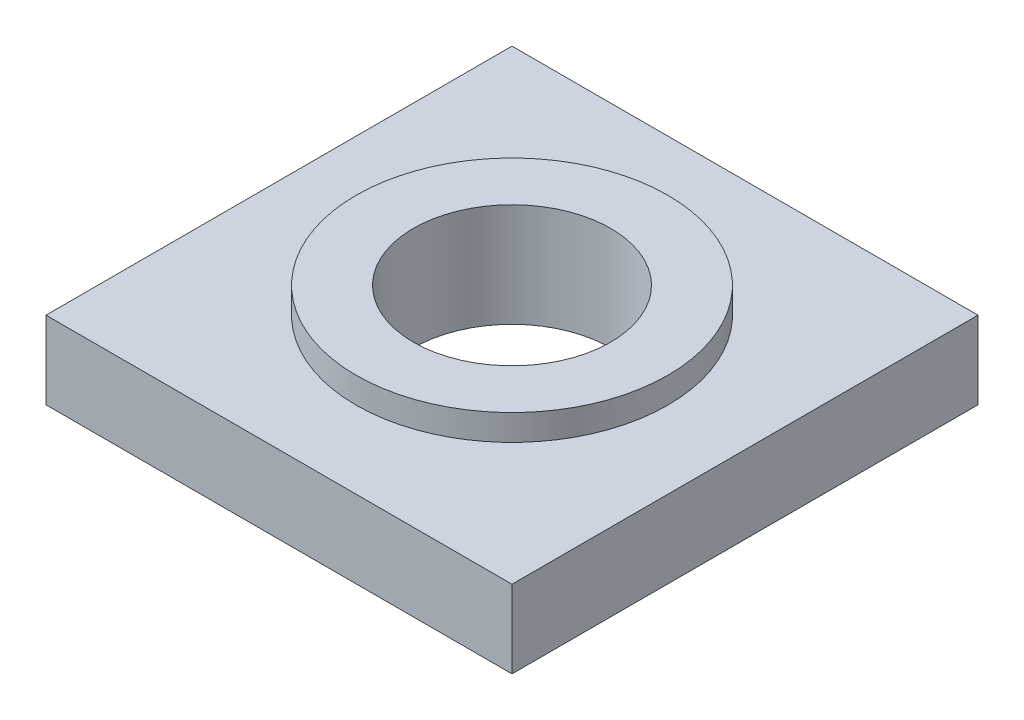
ISO-10303-21;
HEADER;
FILE_DESCRIPTION(('STEP AP214'),'2;1');
FILE_NAME('part.step','',(''),(''),'','','');
FILE_SCHEMA(('AUTOMOTIVE_DESIGN { 1 0 10303 214 1 1 1 1 }'));
ENDSEC;
DATA;
#1=APPLICATION_CONTEXT('core data for automotive mechanical design processes');
#2=APPLICATION_PROTOCOL_DEFINITION('international standard','automotive_design',2000,#1);
#3=PRODUCT_CONTEXT('',#1,'mechanical');
#4=PRODUCT('Part','Part','',(#3));
#5=PRODUCT_RELATED_PRODUCT_CATEGORY('part','',(#4));
#6=PRODUCT_DEFINITION_FORMATION('','',#4);
#7=PRODUCT_DEFINITION_CONTEXT('part definition',#1,'design');
#8=PRODUCT_DEFINITION('design','',#6,#7);
#9=PRODUCT_DEFINITION_SHAPE('','',#8);
#10=(LENGTH_UNIT() NAMED_UNIT(*) SI_UNIT(.MILLI.,.METRE.));
#11=(NAMED_UNIT(*) PLANE_ANGLE_UNIT() SI_UNIT($,.RADIAN.));
#12=(NAMED_UNIT(*) SI_UNIT($,.STERADIAN.) SOLID_ANGLE_UNIT());
#13=UNCERTAINTY_MEASURE_WITH_UNIT(LENGTH_MEASURE(1.E-05),#10,'distance_accuracy_value','');
#14=(GEOMETRIC_REPRESENTATION_CONTEXT(3) GLOBAL_UNCERTAINTY_ASSIGNED_CONTEXT((#13)) GLOBAL_UNIT_ASSIGNED_CONTEXT((#10,
#11,#12)) REPRESENTATION_CONTEXT('',''));
#15=CARTESIAN_POINT('',(0.,0.,0.));
#16=DIRECTION('',(0.,0.,1.));
#17=DIRECTION('',(1.,0.,0.));
#18=AXIS2_PLACEMENT_3D('',#15,#16,#17);
#19=CARTESIAN_POINT('',(0.,15.,0.));
#20=DIRECTION('',(0.,1.,0.));
#21=DIRECTION('',(0.,0.,1.));
#22=AXIS2_PLACEMENT_3D('',#19,#20,#21);
#23=PLANE('',#22);
#24=DIRECTION('',(0.,0.,1.));
#25=VECTOR('',#24,1.);
#26=CARTESIAN_POINT('',(-45.,15.,45.));
#27=LINE('',#26,#25);
#28=CARTESIAN_POINT('',(-45.,15.,-45.));
#29=VERTEX_POINT('',#28);
#30=CARTESIAN_POINT('',(-45.,15.,45.));
#31=VERTEX_POINT('',#30);
#32=EDGE_CURVE('E92',#29,#31,#27,.T.);
#33=ORIENTED_EDGE('',*,*,#32,.T.);
#34=DIRECTION('',(1.,0.,0.));
#35=VECTOR('',#34,1.);
#36=CARTESIAN_POINT('',(45.,15.,45.));
#37=LINE('',#36,#35);
#38=CARTESIAN_POINT('',(45.,15.,45.));
#39=VERTEX_POINT('',#38);
#40=EDGE_CURVE('E87',#31,#39,#37,.T.);
#41=ORIENTED_EDGE('',*,*,#40,.T.);
#42=DIRECTION('',(0.,0.,-1.));
#43=VECTOR('',#42,1.);
#44=CARTESIAN_POINT('',(45.,15.,45.));
#45=LINE('',#44,#43);
#46=CARTESIAN_POINT('',(45.,15.,-45.));
#47=VERTEX_POINT('',#46);
#48=EDGE_CURVE('E90',#39,#47,#45,.T.);
#49=ORIENTED_EDGE('',*,*,#48,.T.);
#50=DIRECTION('',(-1.,0.,0.));
#51=VECTOR('',#50,1.);
#52=CARTESIAN_POINT('',(45.,15.,-45.));
#53=LINE('',#52,#51);
#54=EDGE_CURVE('E57',#47,#29,#53,.T.);
#55=ORIENTED_EDGE('',*,*,#54,.T.);
#56=EDGE_LOOP('',(#33,#41,#49,#55));
#57=FACE_BOUND('',#56,.T.);
#58=CARTESIAN_POINT('',(0.,15.,0.));
#59=DIRECTION('',(0.,1.,0.));
#60=DIRECTION('',(0.,0.,1.));
#61=AXIS2_PLACEMENT_3D('',#58,#59,#60);
#62=CIRCLE('',#61,30.1063586478808);
#63=CARTESIAN_POINT('',(0.,15.,30.1063586478808));
#64=VERTEX_POINT('',#63);
#65=EDGE_CURVE('E134',#64,#64,#62,.T.);
#66=ORIENTED_EDGE('',*,*,#65,.F.);
#67=EDGE_LOOP('',(#66));
#68=FACE_BOUND('',#67,.T.);
#69=ADVANCED_FACE('F39',(#57,#68),#23,.T.);
#70=CARTESIAN_POINT('',(0.,0.,0.));
#71=DIRECTION('',(0.,1.,0.));
#72=DIRECTION('',(0.,0.,1.));
#73=AXIS2_PLACEMENT_3D('',#70,#71,#72);
#74=PLANE('',#73);
#75=DIRECTION('',(0.,0.,1.));
#76=VECTOR('',#75,1.);
#77=CARTESIAN_POINT('',(-45.,0.,45.));
#78=LINE('',#77,#76);
#79=CARTESIAN_POINT('',(-45.,0.,-45.));
#80=VERTEX_POINT('',#79);
#81=CARTESIAN_POINT('',(-45.,0.,45.));
#82=VERTEX_POINT('',#81);
#83=EDGE_CURVE('E108',#80,#82,#78,.T.);
#84=ORIENTED_EDGE('',*,*,#83,.F.);
#85=DIRECTION('',(-1.,0.,0.));
#86=VECTOR('',#85,1.);
#87=CARTESIAN_POINT('',(45.,0.,-45.));
#88=LINE('',#87,#86);
#89=CARTESIAN_POINT('',(45.,0.,-45.));
#90=VERTEX_POINT('',#89);
#91=EDGE_CURVE('E80',#90,#80,#88,.T.);
#92=ORIENTED_EDGE('',*,*,#91,.F.);
#93=DIRECTION('',(0.,0.,-1.));
#94=VECTOR('',#93,1.);
#95=CARTESIAN_POINT('',(45.,0.,45.));
#96=LINE('',#95,#94);
#97=CARTESIAN_POINT('',(45.,0.,45.));
#98=VERTEX_POINT('',#97);
#99=EDGE_CURVE('E74',#98,#90,#96,.T.);
#100=ORIENTED_EDGE('',*,*,#99,.F.);
#101=DIRECTION('',(1.,0.,0.));
#102=VECTOR('',#101,1.);
#103=CARTESIAN_POINT('',(45.,0.,45.));
#104=LINE('',#103,#102);
#105=EDGE_CURVE('E97',#82,#98,#104,.T.);
#106=ORIENTED_EDGE('',*,*,#105,.F.);
#107=EDGE_LOOP('',(#84,#92,#100,#106));
#108=FACE_BOUND('',#107,.T.);
#109=CARTESIAN_POINT('',(0.,0.,0.));
#110=DIRECTION('',(0.,1.,0.));
#111=DIRECTION('',(0.,0.,1.));
#112=AXIS2_PLACEMENT_3D('',#109,#110,#111);
#113=CIRCLE('',#112,19.05);
#114=CARTESIAN_POINT('',(0.,0.,19.05));
#115=VERTEX_POINT('',#114);
#116=EDGE_CURVE('E112',#115,#115,#113,.T.);
#117=ORIENTED_EDGE('',*,*,#116,.T.);
#118=EDGE_LOOP('',(#117));
#119=FACE_BOUND('',#118,.T.);
#120=ADVANCED_FACE('F125',(#108,#119),#74,.F.);
#121=CARTESIAN_POINT('',(-45.,15.,45.));
#122=DIRECTION('',(1.,0.,0.));
#123=DIRECTION('',(0.,0.,-1.));
#124=AXIS2_PLACEMENT_3D('',#121,#122,#123);
#125=PLANE('',#124);
#126=ORIENTED_EDGE('',*,*,#83,.T.);
#127=DIRECTION('',(0.,-1.,0.));
#128=VECTOR('',#127,1.);
#129=CARTESIAN_POINT('',(-45.,15.,45.));
#130=LINE('',#129,#128);
#131=EDGE_CURVE('E11',#31,#82,#130,.T.);
#132=ORIENTED_EDGE('',*,*,#131,.F.);
#133=ORIENTED_EDGE('',*,*,#32,.F.);
#134=DIRECTION('',(0.,-1.,0.));
#135=VECTOR('',#134,1.);
#136=CARTESIAN_POINT('',(-45.,15.,-45.));
#137=LINE('',#136,#135);
#138=EDGE_CURVE('E104',#29,#80,#137,.T.);
#139=ORIENTED_EDGE('',*,*,#138,.T.);
#140=EDGE_LOOP('',(#126,#132,#133,#139));
#141=FACE_BOUND('',#140,.T.);
#142=ADVANCED_FACE('F41',(#141),#125,.F.);
#143=CARTESIAN_POINT('',(45.,15.,45.));
#144=DIRECTION('',(0.,0.,-1.));
#145=DIRECTION('',(-1.,0.,0.));
#146=AXIS2_PLACEMENT_3D('',#143,#144,#145);
#147=PLANE('',#146);
#148=ORIENTED_EDGE('',*,*,#105,.T.);
#149=DIRECTION('',(0.,-1.,0.));
#150=VECTOR('',#149,1.);
#151=CARTESIAN_POINT('',(45.,15.,45.));
#152=LINE('',#151,#150);
#153=EDGE_CURVE('E49',#39,#98,#152,.T.);
#154=ORIENTED_EDGE('',*,*,#153,.F.);
#155=ORIENTED_EDGE('',*,*,#40,.F.);
#156=ORIENTED_EDGE('',*,*,#131,.T.);
#157=EDGE_LOOP('',(#148,#154,#155,#156));
#158=FACE_BOUND('',#157,.T.);
#159=ADVANCED_FACE('F96',(#158),#147,.F.);
#160=CARTESIAN_POINT('',(45.,15.,45.));
#161=DIRECTION('',(-1.,0.,0.));
#162=DIRECTION('',(0.,0.,1.));
#163=AXIS2_PLACEMENT_3D('',#160,#161,#162);
#164=PLANE('',#163);
#165=ORIENTED_EDGE('',*,*,#99,.T.);
#166=DIRECTION('',(0.,-1.,0.));
#167=VECTOR('',#166,1.);
#168=CARTESIAN_POINT('',(45.,15.,-45.));
#169=LINE('',#168,#167);
#170=EDGE_CURVE('E99',#47,#90,#169,.T.);
#171=ORIENTED_EDGE('',*,*,#170,.F.);
#172=ORIENTED_EDGE('',*,*,#48,.F.);
#173=ORIENTED_EDGE('',*,*,#153,.T.);
#174=EDGE_LOOP('',(#165,#171,#172,#173));
#175=FACE_BOUND('',#174,.T.);
#176=ADVANCED_FACE('F100',(#175),#164,.F.);
#177=CARTESIAN_POINT('',(45.,15.,-45.));
#178=DIRECTION('',(0.,0.,1.));
#179=DIRECTION('',(1.,0.,0.));
#180=AXIS2_PLACEMENT_3D('',#177,#178,#179);
#181=PLANE('',#180);
#182=ORIENTED_EDGE('',*,*,#91,.T.);
#183=ORIENTED_EDGE('',*,*,#138,.F.);
#184=ORIENTED_EDGE('',*,*,#54,.F.);
#185=ORIENTED_EDGE('',*,*,#170,.T.);
#186=EDGE_LOOP('',(#182,#183,#184,#185));
#187=FACE_BOUND('',#186,.T.);
#188=ADVANCED_FACE('F122',(#187),#181,.F.);
#189=CARTESIAN_POINT('',(0.,15.,0.));
#190=DIRECTION('',(0.,-1.,0.));
#191=DIRECTION('',(0.,0.,-1.));
#192=AXIS2_PLACEMENT_3D('',#189,#190,#191);
#193=CYLINDRICAL_SURFACE('',#192,19.05);
#194=ORIENTED_EDGE('',*,*,#116,.F.);
#195=EDGE_LOOP('',(#194));
#196=FACE_BOUND('',#195,.T.);
#197=CARTESIAN_POINT('',(0.,20.,0.));
#198=DIRECTION('',(0.,1.,0.));
#199=DIRECTION('',(0.,0.,1.));
#200=AXIS2_PLACEMENT_3D('',#197,#198,#199);
#201=CIRCLE('',#200,19.05);
#202=CARTESIAN_POINT('',(0.,20.,19.05));
#203=VERTEX_POINT('',#202);
#204=EDGE_CURVE('E138',#203,#203,#201,.T.);
#205=ORIENTED_EDGE('',*,*,#204,.T.);
#206=EDGE_LOOP('',(#205));
#207=FACE_BOUND('',#206,.T.);
#208=ADVANCED_FACE('F146',(#196,#207),#193,.F.);
#209=CARTESIAN_POINT('',(0.,20.,0.));
#210=DIRECTION('',(0.,1.,0.));
#211=DIRECTION('',(0.,0.,1.));
#212=AXIS2_PLACEMENT_3D('',#209,#210,#211);
#213=PLANE('',#212);
#214=CARTESIAN_POINT('',(0.,20.,0.));
#215=DIRECTION('',(0.,1.,0.));
#216=DIRECTION('',(0.,0.,1.));
#217=AXIS2_PLACEMENT_3D('',#214,#215,#216);
#218=CIRCLE('',#217,30.1063586478808);
#219=CARTESIAN_POINT('',(0.,20.,30.1063586478808));
#220=VERTEX_POINT('',#219);
#221=EDGE_CURVE('E133',#220,#220,#218,.T.);
#222=ORIENTED_EDGE('',*,*,#221,.T.);
#223=EDGE_LOOP('',(#222));
#224=FACE_BOUND('',#223,.T.);
#225=ORIENTED_EDGE('',*,*,#204,.F.);
#226=EDGE_LOOP('',(#225));
#227=FACE_BOUND('',#226,.T.);
#228=ADVANCED_FACE('F148',(#224,#227),#213,.T.);
#229=CARTESIAN_POINT('',(0.,20.,0.));
#230=DIRECTION('',(0.,-1.,0.));
#231=DIRECTION('',(0.,0.,-1.));
#232=AXIS2_PLACEMENT_3D('',#229,#230,#231);
#233=CYLINDRICAL_SURFACE('',#232,30.1063586478808);
#234=ORIENTED_EDGE('',*,*,#221,.F.);
#235=EDGE_LOOP('',(#234));
#236=FACE_BOUND('',#235,.T.);
#237=ORIENTED_EDGE('',*,*,#65,.T.);
#238=EDGE_LOOP('',(#237));
#239=FACE_BOUND('',#238,.T.);
#240=ADVANCED_FACE('F150',(#236,#239),#233,.T.);
#241=CLOSED_SHELL('',(#69,#120,#142,#159,#176,#188,#208,#228,#240));
#242=MANIFOLD_SOLID_BREP('B2',#241);
#243=ADVANCED_BREP_SHAPE_REPRESENTATION('',(#18,#242),#14);
#244=SHAPE_DEFINITION_REPRESENTATION(#9,#243);
ENDSEC;
END-ISO-10303-21;
